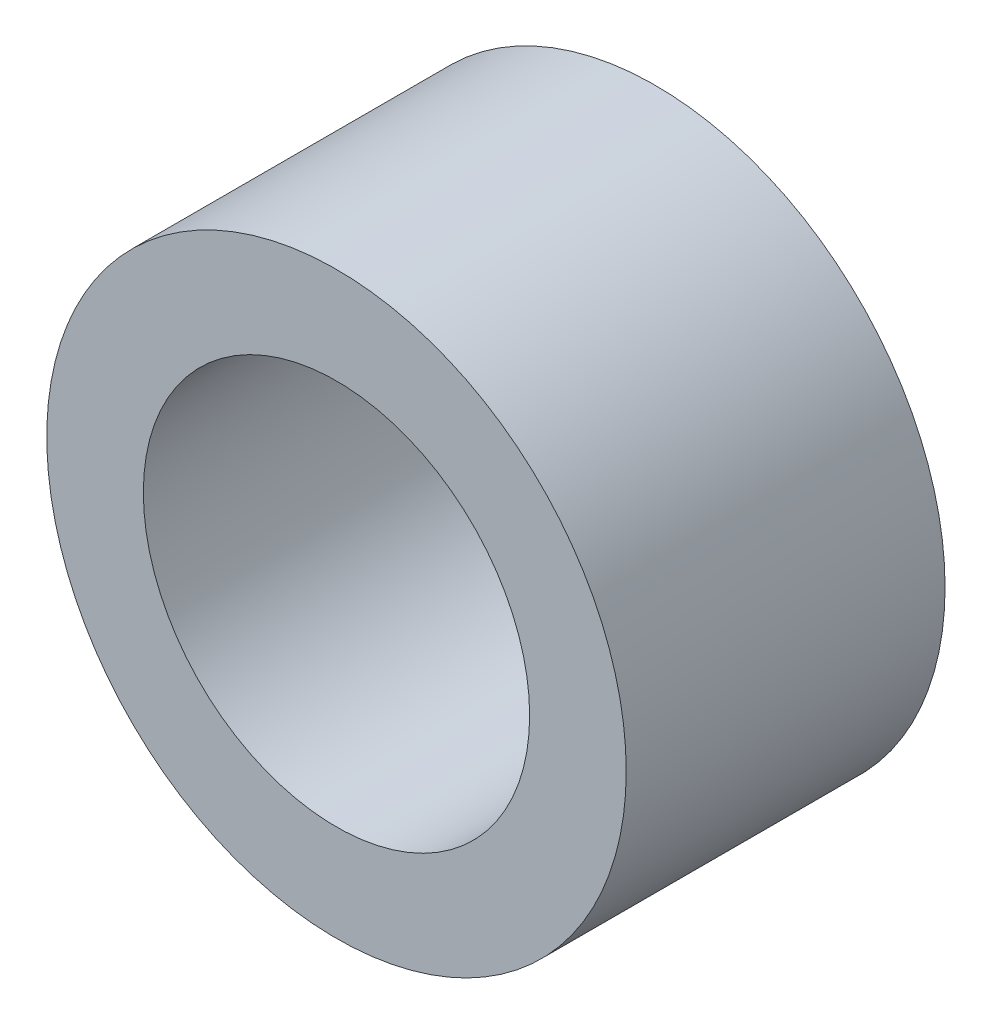
ISO-10303-21;
HEADER;
FILE_DESCRIPTION(('STEP AP214'),'2;1');
FILE_NAME('part.step','',(''),(''),'','','');
FILE_SCHEMA(('AUTOMOTIVE_DESIGN { 1 0 10303 214 1 1 1 1 }'));
ENDSEC;
DATA;
#1=APPLICATION_CONTEXT('core data for automotive mechanical design processes');
#2=APPLICATION_PROTOCOL_DEFINITION('international standard','automotive_design',2000,#1);
#3=PRODUCT_CONTEXT('',#1,'mechanical');
#4=PRODUCT('Part','Part','',(#3));
#5=PRODUCT_RELATED_PRODUCT_CATEGORY('part','',(#4));
#6=PRODUCT_DEFINITION_FORMATION('','',#4);
#7=PRODUCT_DEFINITION_CONTEXT('part definition',#1,'design');
#8=PRODUCT_DEFINITION('design','',#6,#7);
#9=PRODUCT_DEFINITION_SHAPE('','',#8);
#10=(LENGTH_UNIT() NAMED_UNIT(*) SI_UNIT(.MILLI.,.METRE.));
#11=(NAMED_UNIT(*) PLANE_ANGLE_UNIT() SI_UNIT($,.RADIAN.));
#12=(NAMED_UNIT(*) SI_UNIT($,.STERADIAN.) SOLID_ANGLE_UNIT());
#13=UNCERTAINTY_MEASURE_WITH_UNIT(LENGTH_MEASURE(1.E-05),#10,'distance_accuracy_value','');
#14=(GEOMETRIC_REPRESENTATION_CONTEXT(3) GLOBAL_UNCERTAINTY_ASSIGNED_CONTEXT((#13)) GLOBAL_UNIT_ASSIGNED_CONTEXT((#10,
#11,#12)) REPRESENTATION_CONTEXT('',''));
#15=CARTESIAN_POINT('',(0.,0.,0.));
#16=DIRECTION('',(0.,0.,1.));
#17=DIRECTION('',(1.,0.,0.));
#18=AXIS2_PLACEMENT_3D('',#15,#16,#17);
#19=CARTESIAN_POINT('',(0.,0.,7.9375));
#20=DIRECTION('',(0.,0.,1.));
#21=DIRECTION('',(1.,0.,0.));
#22=AXIS2_PLACEMENT_3D('',#19,#20,#21);
#23=CYLINDRICAL_SURFACE('',#22,9.525);
#24=CARTESIAN_POINT('',(0.,0.,-7.86130000000003));
#25=DIRECTION('',(0.,0.,1.));
#26=DIRECTION('',(1.,0.,0.));
#27=AXIS2_PLACEMENT_3D('',#24,#25,#26);
#28=CIRCLE('',#27,9.525);
#29=CARTESIAN_POINT('',(9.525,0.,-7.86130000000003));
#30=VERTEX_POINT('',#29);
#31=EDGE_CURVE('E18',#30,#30,#28,.F.);
#32=ORIENTED_EDGE('',*,*,#31,.T.);
#33=EDGE_LOOP('',(#32));
#34=FACE_BOUND('',#33,.T.);
#35=CARTESIAN_POINT('',(0.,0.,7.8613));
#36=DIRECTION('',(0.,0.,1.));
#37=DIRECTION('',(1.,0.,0.));
#38=AXIS2_PLACEMENT_3D('',#35,#36,#37);
#39=CIRCLE('',#38,9.525);
#40=CARTESIAN_POINT('',(9.525,0.,7.8613));
#41=VERTEX_POINT('',#40);
#42=EDGE_CURVE('E27',#41,#41,#39,.T.);
#43=ORIENTED_EDGE('',*,*,#42,.T.);
#44=EDGE_LOOP('',(#43));
#45=FACE_BOUND('',#44,.T.);
#46=ADVANCED_FACE('F15',(#34,#45),#23,.F.);
#47=CARTESIAN_POINT('',(0.,14.2875,-7.86130000000004));
#48=DIRECTION('',(0.,0.,1.));
#49=DIRECTION('',(1.,0.,0.));
#50=AXIS2_PLACEMENT_3D('',#47,#48,#49);
#51=PLANE('',#50);
#52=ORIENTED_EDGE('',*,*,#31,.F.);
#53=EDGE_LOOP('',(#52));
#54=FACE_BOUND('',#53,.T.);
#55=CARTESIAN_POINT('',(0.,0.,-7.86130000000004));
#56=DIRECTION('',(0.,0.,1.));
#57=DIRECTION('',(1.,0.,0.));
#58=AXIS2_PLACEMENT_3D('',#55,#56,#57);
#59=CIRCLE('',#58,14.2875);
#60=CARTESIAN_POINT('',(14.2875,0.,-7.86130000000004));
#61=VERTEX_POINT('',#60);
#62=EDGE_CURVE('E22',#61,#61,#59,.T.);
#63=ORIENTED_EDGE('',*,*,#62,.F.);
#64=EDGE_LOOP('',(#63));
#65=FACE_BOUND('',#64,.T.);
#66=ADVANCED_FACE('F36',(#54,#65),#51,.F.);
#67=CARTESIAN_POINT('',(0.,14.2875,7.8613));
#68=DIRECTION('',(0.,0.,-1.));
#69=DIRECTION('',(-1.,0.,0.));
#70=AXIS2_PLACEMENT_3D('',#67,#68,#69);
#71=PLANE('',#70);
#72=ORIENTED_EDGE('',*,*,#42,.F.);
#73=EDGE_LOOP('',(#72));
#74=FACE_BOUND('',#73,.T.);
#75=CARTESIAN_POINT('',(0.,0.,7.8613));
#76=DIRECTION('',(0.,0.,1.));
#77=DIRECTION('',(1.,0.,0.));
#78=AXIS2_PLACEMENT_3D('',#75,#76,#77);
#79=CIRCLE('',#78,14.2875);
#80=CARTESIAN_POINT('',(14.2875,0.,7.8613));
#81=VERTEX_POINT('',#80);
#82=EDGE_CURVE('E10',#81,#81,#79,.F.);
#83=ORIENTED_EDGE('',*,*,#82,.F.);
#84=EDGE_LOOP('',(#83));
#85=FACE_BOUND('',#84,.T.);
#86=ADVANCED_FACE('F39',(#74,#85),#71,.F.);
#87=CARTESIAN_POINT('',(0.,0.,-7.93750000000004));
#88=DIRECTION('',(0.,0.,1.));
#89=DIRECTION('',(1.,0.,0.));
#90=AXIS2_PLACEMENT_3D('',#87,#88,#89);
#91=CYLINDRICAL_SURFACE('',#90,14.2875);
#92=ORIENTED_EDGE('',*,*,#62,.T.);
#93=EDGE_LOOP('',(#92));
#94=FACE_BOUND('',#93,.T.);
#95=ORIENTED_EDGE('',*,*,#82,.T.);
#96=EDGE_LOOP('',(#95));
#97=FACE_BOUND('',#96,.T.);
#98=ADVANCED_FACE('F42',(#94,#97),#91,.T.);
#99=CLOSED_SHELL('',(#46,#66,#86,#98));
#100=MANIFOLD_SOLID_BREP('B1',#99);
#101=ADVANCED_BREP_SHAPE_REPRESENTATION('',(#18,#100),#14);
#102=SHAPE_DEFINITION_REPRESENTATION(#9,#101);
ENDSEC;
END-ISO-10303-21;
